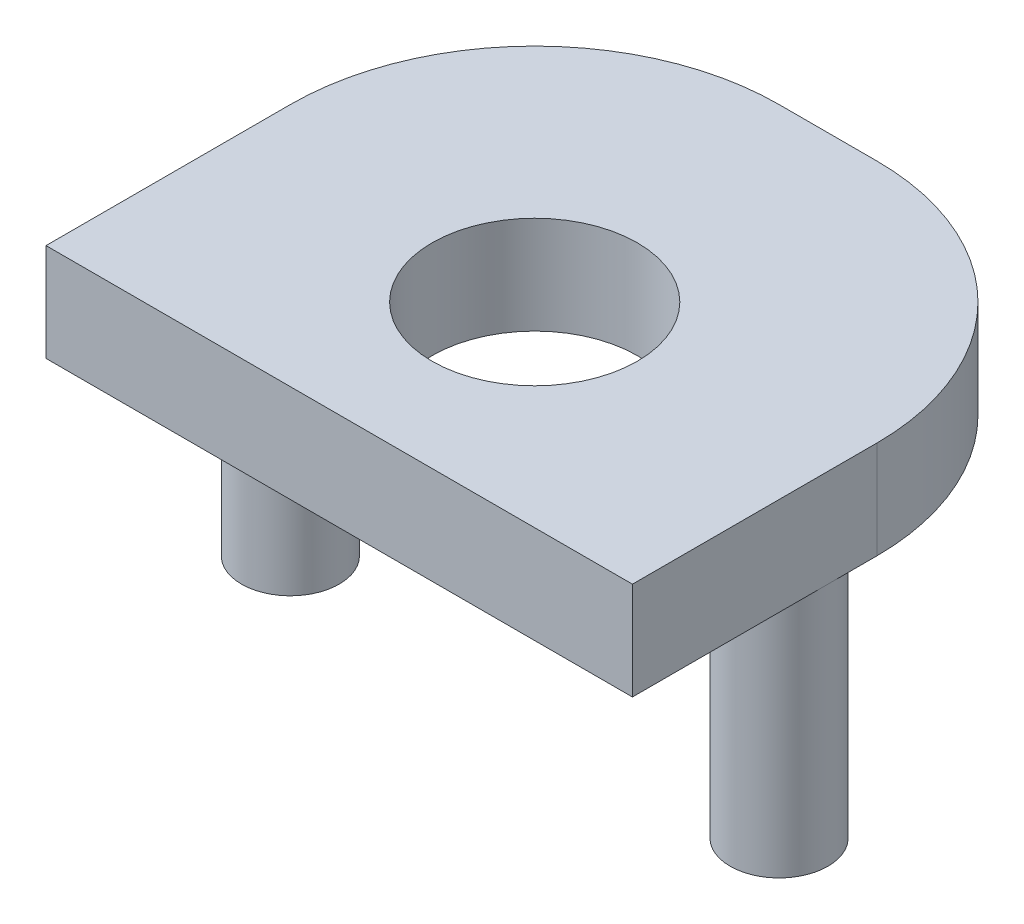
ISO-10303-21;
HEADER;
FILE_DESCRIPTION(('STEP AP214'),'2;1');
FILE_NAME('part.step','',(''),(''),'','','');
FILE_SCHEMA(('AUTOMOTIVE_DESIGN { 1 0 10303 214 1 1 1 1 }'));
ENDSEC;
DATA;
#1=APPLICATION_CONTEXT('core data for automotive mechanical design processes');
#2=APPLICATION_PROTOCOL_DEFINITION('international standard','automotive_design',2000,#1);
#3=PRODUCT_CONTEXT('',#1,'mechanical');
#4=PRODUCT('Part','Part','',(#3));
#5=PRODUCT_RELATED_PRODUCT_CATEGORY('part','',(#4));
#6=PRODUCT_DEFINITION_FORMATION('','',#4);
#7=PRODUCT_DEFINITION_CONTEXT('part definition',#1,'design');
#8=PRODUCT_DEFINITION('design','',#6,#7);
#9=PRODUCT_DEFINITION_SHAPE('','',#8);
#10=(LENGTH_UNIT() NAMED_UNIT(*) SI_UNIT(.MILLI.,.METRE.));
#11=(NAMED_UNIT(*) PLANE_ANGLE_UNIT() SI_UNIT($,.RADIAN.));
#12=(NAMED_UNIT(*) SI_UNIT($,.STERADIAN.) SOLID_ANGLE_UNIT());
#13=UNCERTAINTY_MEASURE_WITH_UNIT(LENGTH_MEASURE(1.E-05),#10,'distance_accuracy_value','');
#14=(GEOMETRIC_REPRESENTATION_CONTEXT(3) GLOBAL_UNCERTAINTY_ASSIGNED_CONTEXT((#13)) GLOBAL_UNIT_ASSIGNED_CONTEXT((#10,
#11,#12)) REPRESENTATION_CONTEXT('',''));
#15=CARTESIAN_POINT('',(0.,0.,0.));
#16=DIRECTION('',(0.,0.,1.));
#17=DIRECTION('',(1.,0.,0.));
#18=AXIS2_PLACEMENT_3D('',#15,#16,#17);
#19=CARTESIAN_POINT('',(0.,0.,0.));
#20=DIRECTION('',(0.,1.,0.));
#21=DIRECTION('',(0.,0.,1.));
#22=AXIS2_PLACEMENT_3D('',#19,#20,#21);
#23=PLANE('',#22);
#24=CARTESIAN_POINT('',(-5.,0.,0.));
#25=DIRECTION('',(0.,1.,0.));
#26=DIRECTION('',(0.,0.,1.));
#27=AXIS2_PLACEMENT_3D('',#24,#25,#26);
#28=CIRCLE('',#27,0.999999999999999);
#29=CARTESIAN_POINT('',(-5.,0.,0.999999999999964));
#30=VERTEX_POINT('',#29);
#31=EDGE_CURVE('E153',#30,#30,#28,.T.);
#32=ORIENTED_EDGE('',*,*,#31,.F.);
#33=EDGE_LOOP('',(#32));
#34=FACE_BOUND('',#33,.T.);
#35=ADVANCED_FACE('F65',(#34),#23,.F.);
#36=CARTESIAN_POINT('',(-5.,5.,0.));
#37=DIRECTION('',(0.,-1.,0.));
#38=DIRECTION('',(0.,0.,-1.));
#39=AXIS2_PLACEMENT_3D('',#36,#37,#38);
#40=CYLINDRICAL_SURFACE('',#39,0.999999999999999);
#41=CARTESIAN_POINT('',(-5.,5.,0.));
#42=DIRECTION('',(0.,1.,0.));
#43=DIRECTION('',(0.,0.,1.));
#44=AXIS2_PLACEMENT_3D('',#41,#42,#43);
#45=CIRCLE('',#44,0.999999999999999);
#46=CARTESIAN_POINT('',(-6.,5.,0.));
#47=VERTEX_POINT('',#46);
#48=EDGE_CURVE('E158',#47,#47,#45,.T.);
#49=ORIENTED_EDGE('',*,*,#48,.F.);
#50=EDGE_LOOP('',(#49));
#51=FACE_BOUND('',#50,.T.);
#52=ORIENTED_EDGE('',*,*,#31,.T.);
#53=EDGE_LOOP('',(#52));
#54=FACE_BOUND('',#53,.T.);
#55=ADVANCED_FACE('F270',(#51,#54),#40,.T.);
#56=CARTESIAN_POINT('',(-6.,7.,4.));
#57=DIRECTION('',(1.,0.,0.));
#58=DIRECTION('',(0.,0.,-1.));
#59=AXIS2_PLACEMENT_3D('',#56,#57,#58);
#60=PLANE('',#59);
#61=DIRECTION('',(0.,0.,1.));
#62=VECTOR('',#61,1.);
#63=CARTESIAN_POINT('',(-6.,7.,4.));
#64=LINE('',#63,#62);
#65=CARTESIAN_POINT('',(-6.,7.,-0.999999999999999));
#66=VERTEX_POINT('',#65);
#67=CARTESIAN_POINT('',(-6.,7.,4.));
#68=VERTEX_POINT('',#67);
#69=EDGE_CURVE('E128',#66,#68,#64,.T.);
#70=ORIENTED_EDGE('',*,*,#69,.F.);
#71=DIRECTION('',(0.,-1.,0.));
#72=VECTOR('',#71,1.);
#73=CARTESIAN_POINT('',(-6.,7.,-0.999999999999999));
#74=LINE('',#73,#72);
#75=CARTESIAN_POINT('',(-6.,5.,-0.999999999999999));
#76=VERTEX_POINT('',#75);
#77=EDGE_CURVE('E12',#66,#76,#74,.T.);
#78=ORIENTED_EDGE('',*,*,#77,.T.);
#79=DIRECTION('',(0.,0.,1.));
#80=VECTOR('',#79,1.);
#81=CARTESIAN_POINT('',(-6.,5.,4.));
#82=LINE('',#81,#80);
#83=EDGE_CURVE('E218',#76,#47,#82,.T.);
#84=ORIENTED_EDGE('',*,*,#83,.T.);
#85=CARTESIAN_POINT('',(-6.,5.,4.));
#86=VERTEX_POINT('',#85);
#87=EDGE_CURVE('E150',#47,#86,#82,.T.);
#88=ORIENTED_EDGE('',*,*,#87,.T.);
#89=DIRECTION('',(0.,-1.,0.));
#90=VECTOR('',#89,1.);
#91=CARTESIAN_POINT('',(-6.,7.,4.));
#92=LINE('',#91,#90);
#93=EDGE_CURVE('E142',#68,#86,#92,.T.);
#94=ORIENTED_EDGE('',*,*,#93,.F.);
#95=EDGE_LOOP('',(#70,#78,#84,#88,#94));
#96=FACE_BOUND('',#95,.T.);
#97=ADVANCED_FACE('F148',(#96),#60,.F.);
#98=CARTESIAN_POINT('',(-6.,7.,4.));
#99=DIRECTION('',(0.,0.,-1.));
#100=DIRECTION('',(-1.,0.,0.));
#101=AXIS2_PLACEMENT_3D('',#98,#99,#100);
#102=PLANE('',#101);
#103=DIRECTION('',(1.,0.,0.));
#104=VECTOR('',#103,1.);
#105=CARTESIAN_POINT('',(-6.,5.,4.));
#106=LINE('',#105,#104);
#107=CARTESIAN_POINT('',(6.,5.,4.));
#108=VERTEX_POINT('',#107);
#109=EDGE_CURVE('E213',#86,#108,#106,.T.);
#110=ORIENTED_EDGE('',*,*,#109,.T.);
#111=DIRECTION('',(0.,-1.,0.));
#112=VECTOR('',#111,1.);
#113=CARTESIAN_POINT('',(6.,7.,4.));
#114=LINE('',#113,#112);
#115=CARTESIAN_POINT('',(6.,7.,4.));
#116=VERTEX_POINT('',#115);
#117=EDGE_CURVE('E144',#116,#108,#114,.T.);
#118=ORIENTED_EDGE('',*,*,#117,.F.);
#119=DIRECTION('',(1.,0.,0.));
#120=VECTOR('',#119,1.);
#121=CARTESIAN_POINT('',(-6.,7.,4.));
#122=LINE('',#121,#120);
#123=EDGE_CURVE('E131',#68,#116,#122,.T.);
#124=ORIENTED_EDGE('',*,*,#123,.F.);
#125=ORIENTED_EDGE('',*,*,#93,.T.);
#126=EDGE_LOOP('',(#110,#118,#124,#125));
#127=FACE_BOUND('',#126,.T.);
#128=ADVANCED_FACE('F141',(#127),#102,.F.);
#129=CARTESIAN_POINT('',(6.,7.,4.));
#130=DIRECTION('',(-1.,0.,0.));
#131=DIRECTION('',(0.,0.,1.));
#132=AXIS2_PLACEMENT_3D('',#129,#130,#131);
#133=PLANE('',#132);
#134=DIRECTION('',(0.,0.,-1.));
#135=VECTOR('',#134,1.);
#136=CARTESIAN_POINT('',(6.,5.,4.));
#137=LINE('',#136,#135);
#138=CARTESIAN_POINT('',(6.,5.,0.));
#139=VERTEX_POINT('',#138);
#140=CARTESIAN_POINT('',(6.,5.,-0.999999999999999));
#141=VERTEX_POINT('',#140);
#142=EDGE_CURVE('E206',#139,#141,#137,.T.);
#143=ORIENTED_EDGE('',*,*,#142,.T.);
#144=DIRECTION('',(0.,-1.,0.));
#145=VECTOR('',#144,1.);
#146=CARTESIAN_POINT('',(6.,7.,-0.999999999999999));
#147=LINE('',#146,#145);
#148=CARTESIAN_POINT('',(6.,7.,-0.999999999999999));
#149=VERTEX_POINT('',#148);
#150=EDGE_CURVE('E89',#141,#149,#147,.F.);
#151=ORIENTED_EDGE('',*,*,#150,.T.);
#152=DIRECTION('',(0.,0.,-1.));
#153=VECTOR('',#152,1.);
#154=CARTESIAN_POINT('',(6.,7.,4.));
#155=LINE('',#154,#153);
#156=EDGE_CURVE('E146',#116,#149,#155,.T.);
#157=ORIENTED_EDGE('',*,*,#156,.F.);
#158=ORIENTED_EDGE('',*,*,#117,.T.);
#159=EDGE_CURVE('E211',#108,#139,#137,.T.);
#160=ORIENTED_EDGE('',*,*,#159,.T.);
#161=EDGE_LOOP('',(#143,#151,#157,#158,#160));
#162=FACE_BOUND('',#161,.T.);
#163=ADVANCED_FACE('F209',(#162),#133,.F.);
#164=CARTESIAN_POINT('',(-6.,7.,-6.));
#165=DIRECTION('',(0.,0.,1.));
#166=DIRECTION('',(1.,0.,0.));
#167=AXIS2_PLACEMENT_3D('',#164,#165,#166);
#168=PLANE('',#167);
#169=DIRECTION('',(-1.,0.,0.));
#170=VECTOR('',#169,1.);
#171=CARTESIAN_POINT('',(-6.,7.,-6.));
#172=LINE('',#171,#170);
#173=CARTESIAN_POINT('',(1.,7.,-6.));
#174=VERTEX_POINT('',#173);
#175=CARTESIAN_POINT('',(-1.,7.,-6.));
#176=VERTEX_POINT('',#175);
#177=EDGE_CURVE('E160',#174,#176,#172,.T.);
#178=ORIENTED_EDGE('',*,*,#177,.F.);
#179=DIRECTION('',(0.,-1.,0.));
#180=VECTOR('',#179,1.);
#181=CARTESIAN_POINT('',(1.,7.,-6.));
#182=LINE('',#181,#180);
#183=CARTESIAN_POINT('',(1.,5.,-6.));
#184=VERTEX_POINT('',#183);
#185=EDGE_CURVE('E176',#174,#184,#182,.T.);
#186=ORIENTED_EDGE('',*,*,#185,.T.);
#187=DIRECTION('',(-1.,0.,0.));
#188=VECTOR('',#187,1.);
#189=CARTESIAN_POINT('',(-6.,5.,-6.));
#190=LINE('',#189,#188);
#191=CARTESIAN_POINT('',(0.,5.,-6.));
#192=VERTEX_POINT('',#191);
#193=EDGE_CURVE('E137',#184,#192,#190,.T.);
#194=ORIENTED_EDGE('',*,*,#193,.T.);
#195=CARTESIAN_POINT('',(-1.,5.,-6.));
#196=VERTEX_POINT('',#195);
#197=EDGE_CURVE('E217',#192,#196,#190,.T.);
#198=ORIENTED_EDGE('',*,*,#197,.T.);
#199=DIRECTION('',(0.,-1.,0.));
#200=VECTOR('',#199,1.);
#201=CARTESIAN_POINT('',(-1.,7.,-6.));
#202=LINE('',#201,#200);
#203=EDGE_CURVE('E166',#196,#176,#202,.F.);
#204=ORIENTED_EDGE('',*,*,#203,.T.);
#205=EDGE_LOOP('',(#178,#186,#194,#198,#204));
#206=FACE_BOUND('',#205,.T.);
#207=ADVANCED_FACE('F195',(#206),#168,.F.);
#208=CARTESIAN_POINT('',(0.,7.,0.));
#209=DIRECTION('',(0.,-1.,0.));
#210=DIRECTION('',(0.,0.,-1.));
#211=AXIS2_PLACEMENT_3D('',#208,#209,#210);
#212=PLANE('',#211);
#213=CARTESIAN_POINT('',(0.,7.,0.));
#214=DIRECTION('',(0.,-1.,0.));
#215=DIRECTION('',(0.,0.,-1.));
#216=AXIS2_PLACEMENT_3D('',#213,#214,#215);
#217=CIRCLE('',#216,2.1);
#218=CARTESIAN_POINT('',(0.,7.,-2.1));
#219=VERTEX_POINT('',#218);
#220=EDGE_CURVE('E173',#219,#219,#217,.T.);
#221=ORIENTED_EDGE('',*,*,#220,.T.);
#222=EDGE_LOOP('',(#221));
#223=FACE_BOUND('',#222,.T.);
#224=ORIENTED_EDGE('',*,*,#156,.T.);
#225=CARTESIAN_POINT('',(1.,7.,-0.999999999999999));
#226=DIRECTION('',(0.,-1.,0.));
#227=DIRECTION('',(0.,0.,-1.));
#228=AXIS2_PLACEMENT_3D('',#225,#226,#227);
#229=CIRCLE('',#228,5.);
#230=EDGE_CURVE('E74',#149,#174,#229,.F.);
#231=ORIENTED_EDGE('',*,*,#230,.T.);
#232=ORIENTED_EDGE('',*,*,#177,.T.);
#233=CARTESIAN_POINT('',(-1.,7.,-0.999999999999999));
#234=DIRECTION('',(0.,-1.,0.));
#235=DIRECTION('',(0.,0.,-1.));
#236=AXIS2_PLACEMENT_3D('',#233,#234,#235);
#237=CIRCLE('',#236,5.);
#238=EDGE_CURVE('E81',#176,#66,#237,.F.);
#239=ORIENTED_EDGE('',*,*,#238,.T.);
#240=ORIENTED_EDGE('',*,*,#69,.T.);
#241=ORIENTED_EDGE('',*,*,#123,.T.);
#242=EDGE_LOOP('',(#224,#231,#232,#239,#240,#241));
#243=FACE_BOUND('',#242,.T.);
#244=ADVANCED_FACE('F130',(#223,#243),#212,.F.);
#245=CARTESIAN_POINT('',(0.,5.,0.));
#246=DIRECTION('',(0.,-1.,0.));
#247=DIRECTION('',(0.,0.,-1.));
#248=AXIS2_PLACEMENT_3D('',#245,#246,#247);
#249=PLANE('',#248);
#250=CARTESIAN_POINT('',(0.,5.,0.));
#251=DIRECTION('',(0.,-1.,0.));
#252=DIRECTION('',(0.,0.,-1.));
#253=AXIS2_PLACEMENT_3D('',#250,#251,#252);
#254=CIRCLE('',#253,2.1);
#255=CARTESIAN_POINT('',(0.,5.,-2.1));
#256=VERTEX_POINT('',#255);
#257=EDGE_CURVE('E168',#256,#256,#254,.F.);
#258=ORIENTED_EDGE('',*,*,#257,.T.);
#259=EDGE_LOOP('',(#258));
#260=FACE_BOUND('',#259,.T.);
#261=ORIENTED_EDGE('',*,*,#193,.F.);
#262=CARTESIAN_POINT('',(1.,5.,-0.999999999999999));
#263=DIRECTION('',(0.,-1.,0.));
#264=DIRECTION('',(0.,0.,-1.));
#265=AXIS2_PLACEMENT_3D('',#262,#263,#264);
#266=CIRCLE('',#265,5.);
#267=EDGE_CURVE('E183',#184,#141,#266,.T.);
#268=ORIENTED_EDGE('',*,*,#267,.T.);
#269=ORIENTED_EDGE('',*,*,#142,.F.);
#270=CARTESIAN_POINT('',(5.,5.,0.));
#271=DIRECTION('',(0.,1.,0.));
#272=DIRECTION('',(0.,0.,1.));
#273=AXIS2_PLACEMENT_3D('',#270,#271,#272);
#274=CIRCLE('',#273,1.);
#275=EDGE_CURVE('E172',#139,#139,#274,.T.);
#276=ORIENTED_EDGE('',*,*,#275,.T.);
#277=ORIENTED_EDGE('',*,*,#159,.F.);
#278=ORIENTED_EDGE('',*,*,#109,.F.);
#279=ORIENTED_EDGE('',*,*,#87,.F.);
#280=ORIENTED_EDGE('',*,*,#48,.T.);
#281=ORIENTED_EDGE('',*,*,#83,.F.);
#282=CARTESIAN_POINT('',(-1.,5.,-0.999999999999999));
#283=DIRECTION('',(0.,-1.,0.));
#284=DIRECTION('',(0.,0.,-1.));
#285=AXIS2_PLACEMENT_3D('',#282,#283,#284);
#286=CIRCLE('',#285,5.);
#287=EDGE_CURVE('E180',#76,#196,#286,.T.);
#288=ORIENTED_EDGE('',*,*,#287,.T.);
#289=ORIENTED_EDGE('',*,*,#197,.F.);
#290=CARTESIAN_POINT('',(0.,5.,-5.));
#291=DIRECTION('',(0.,1.,0.));
#292=DIRECTION('',(0.,0.,1.));
#293=AXIS2_PLACEMENT_3D('',#290,#291,#292);
#294=CIRCLE('',#293,1.);
#295=EDGE_CURVE('E234',#192,#192,#294,.T.);
#296=ORIENTED_EDGE('',*,*,#295,.T.);
#297=EDGE_LOOP('',(#261,#268,#269,#276,#277,#278,#279,#280,#281,#288,#289,#296));
#298=FACE_BOUND('',#297,.T.);
#299=ADVANCED_FACE('F204',(#260,#298),#249,.T.);
#300=CARTESIAN_POINT('',(0.,0.,0.));
#301=DIRECTION('',(0.,1.,0.));
#302=DIRECTION('',(0.,0.,1.));
#303=AXIS2_PLACEMENT_3D('',#300,#301,#302);
#304=PLANE('',#303);
#305=CARTESIAN_POINT('',(0.,0.,-5.));
#306=DIRECTION('',(0.,1.,0.));
#307=DIRECTION('',(0.,0.,1.));
#308=AXIS2_PLACEMENT_3D('',#305,#306,#307);
#309=CIRCLE('',#308,1.);
#310=CARTESIAN_POINT('',(0.,0.,-4.));
#311=VERTEX_POINT('',#310);
#312=EDGE_CURVE('E230',#311,#311,#309,.T.);
#313=ORIENTED_EDGE('',*,*,#312,.F.);
#314=EDGE_LOOP('',(#313));
#315=FACE_BOUND('',#314,.T.);
#316=ADVANCED_FACE('F264',(#315),#304,.F.);
#317=CARTESIAN_POINT('',(0.,5.,-5.));
#318=DIRECTION('',(0.,-1.,0.));
#319=DIRECTION('',(0.,0.,-1.));
#320=AXIS2_PLACEMENT_3D('',#317,#318,#319);
#321=CYLINDRICAL_SURFACE('',#320,1.);
#322=ORIENTED_EDGE('',*,*,#295,.F.);
#323=EDGE_LOOP('',(#322));
#324=FACE_BOUND('',#323,.T.);
#325=ORIENTED_EDGE('',*,*,#312,.T.);
#326=EDGE_LOOP('',(#325));
#327=FACE_BOUND('',#326,.T.);
#328=ADVANCED_FACE('F267',(#324,#327),#321,.T.);
#329=CARTESIAN_POINT('',(0.,0.,0.));
#330=DIRECTION('',(0.,1.,0.));
#331=DIRECTION('',(0.,0.,1.));
#332=AXIS2_PLACEMENT_3D('',#329,#330,#331);
#333=PLANE('',#332);
#334=CARTESIAN_POINT('',(5.,0.,0.));
#335=DIRECTION('',(0.,1.,0.));
#336=DIRECTION('',(0.,0.,1.));
#337=AXIS2_PLACEMENT_3D('',#334,#335,#336);
#338=CIRCLE('',#337,1.);
#339=CARTESIAN_POINT('',(5.,0.,1.));
#340=VERTEX_POINT('',#339);
#341=EDGE_CURVE('E237',#340,#340,#338,.T.);
#342=ORIENTED_EDGE('',*,*,#341,.F.);
#343=EDGE_LOOP('',(#342));
#344=FACE_BOUND('',#343,.T.);
#345=ADVANCED_FACE('F256',(#344),#333,.F.);
#346=CARTESIAN_POINT('',(5.,5.,0.));
#347=DIRECTION('',(0.,-1.,0.));
#348=DIRECTION('',(0.,0.,-1.));
#349=AXIS2_PLACEMENT_3D('',#346,#347,#348);
#350=CYLINDRICAL_SURFACE('',#349,1.);
#351=ORIENTED_EDGE('',*,*,#275,.F.);
#352=EDGE_LOOP('',(#351));
#353=FACE_BOUND('',#352,.T.);
#354=ORIENTED_EDGE('',*,*,#341,.T.);
#355=EDGE_LOOP('',(#354));
#356=FACE_BOUND('',#355,.T.);
#357=ADVANCED_FACE('F253',(#353,#356),#350,.T.);
#358=CARTESIAN_POINT('',(0.,12.939696961967,0.));
#359=DIRECTION('',(0.,-1.,0.));
#360=DIRECTION('',(0.,0.,-1.));
#361=AXIS2_PLACEMENT_3D('',#358,#359,#360);
#362=CYLINDRICAL_SURFACE('',#361,2.1);
#363=ORIENTED_EDGE('',*,*,#257,.F.);
#364=EDGE_LOOP('',(#363));
#365=FACE_BOUND('',#364,.T.);
#366=ORIENTED_EDGE('',*,*,#220,.F.);
#367=EDGE_LOOP('',(#366));
#368=FACE_BOUND('',#367,.T.);
#369=ADVANCED_FACE('F251',(#365,#368),#362,.F.);
#370=CARTESIAN_POINT('',(1.,7.,-0.999999999999999));
#371=DIRECTION('',(0.,-1.,0.));
#372=DIRECTION('',(0.,0.,-1.));
#373=AXIS2_PLACEMENT_3D('',#370,#371,#372);
#374=CYLINDRICAL_SURFACE('',#373,5.);
#375=ORIENTED_EDGE('',*,*,#230,.F.);
#376=ORIENTED_EDGE('',*,*,#150,.F.);
#377=ORIENTED_EDGE('',*,*,#267,.F.);
#378=ORIENTED_EDGE('',*,*,#185,.F.);
#379=EDGE_LOOP('',(#375,#376,#377,#378));
#380=FACE_BOUND('',#379,.T.);
#381=ADVANCED_FACE('F201',(#380),#374,.T.);
#382=CARTESIAN_POINT('',(-1.,7.,-0.999999999999999));
#383=DIRECTION('',(0.,-1.,0.));
#384=DIRECTION('',(0.,0.,-1.));
#385=AXIS2_PLACEMENT_3D('',#382,#383,#384);
#386=CYLINDRICAL_SURFACE('',#385,5.);
#387=ORIENTED_EDGE('',*,*,#238,.F.);
#388=ORIENTED_EDGE('',*,*,#203,.F.);
#389=ORIENTED_EDGE('',*,*,#287,.F.);
#390=ORIENTED_EDGE('',*,*,#77,.F.);
#391=EDGE_LOOP('',(#387,#388,#389,#390));
#392=FACE_BOUND('',#391,.T.);
#393=ADVANCED_FACE('F67',(#392),#386,.T.);
#394=CLOSED_SHELL('',(#35,#55,#97,#128,#163,#207,#244,#299,#316,#328,#345,#357,#369,#381,#393));
#395=MANIFOLD_SOLID_BREP('B2',#394);
#396=ADVANCED_BREP_SHAPE_REPRESENTATION('',(#18,#395),#14);
#397=SHAPE_DEFINITION_REPRESENTATION(#9,#396);
ENDSEC;
END-ISO-10303-21;
